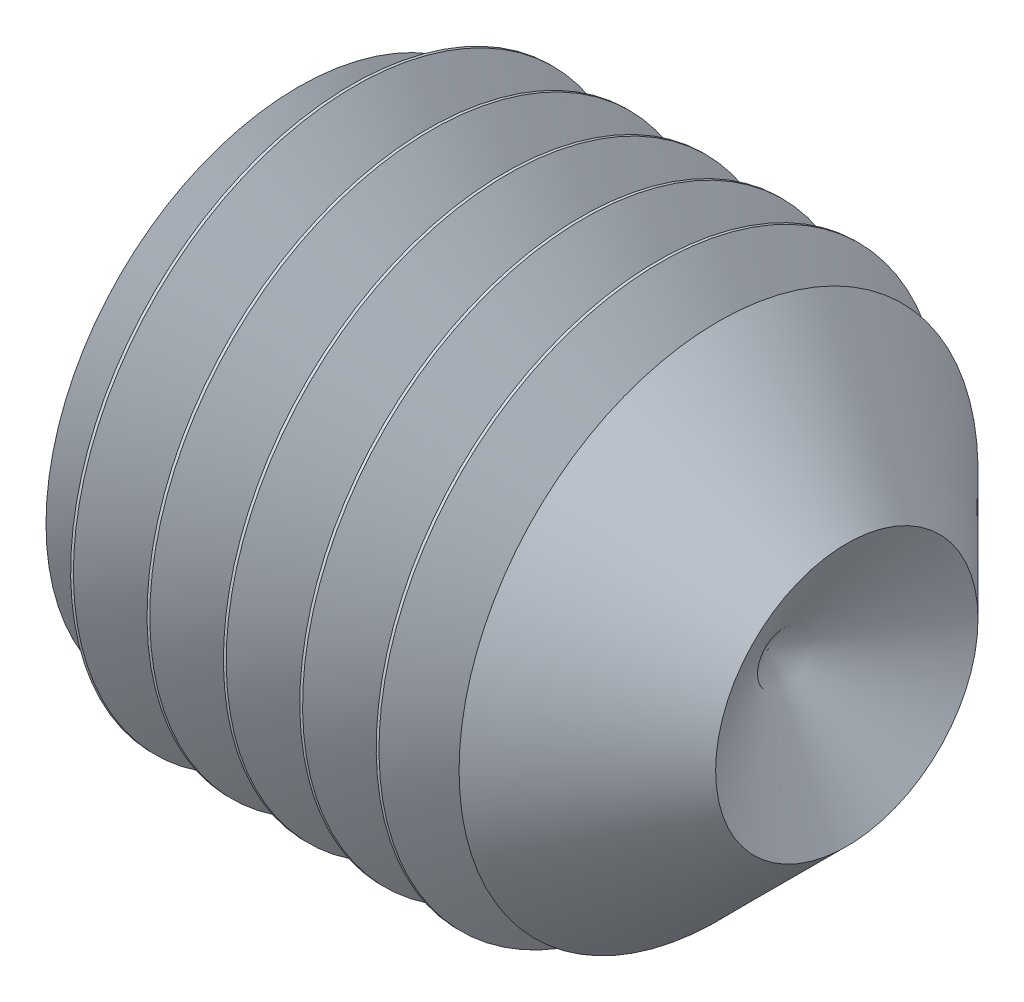
ISO-10303-21;
HEADER;
FILE_DESCRIPTION(('STEP AP214'),'2;1');
FILE_NAME('part.step','',(''),(''),'','','');
FILE_SCHEMA(('AUTOMOTIVE_DESIGN { 1 0 10303 214 1 1 1 1 }'));
ENDSEC;
DATA;
#1=APPLICATION_CONTEXT('core data for automotive mechanical design processes');
#2=APPLICATION_PROTOCOL_DEFINITION('international standard','automotive_design',2000,#1);
#3=PRODUCT_CONTEXT('',#1,'mechanical');
#4=PRODUCT('Part','Part','',(#3));
#5=PRODUCT_RELATED_PRODUCT_CATEGORY('part','',(#4));
#6=PRODUCT_DEFINITION_FORMATION('','',#4);
#7=PRODUCT_DEFINITION_CONTEXT('part definition',#1,'design');
#8=PRODUCT_DEFINITION('design','',#6,#7);
#9=PRODUCT_DEFINITION_SHAPE('','',#8);
#10=(LENGTH_UNIT() NAMED_UNIT(*) SI_UNIT(.MILLI.,.METRE.));
#11=(NAMED_UNIT(*) PLANE_ANGLE_UNIT() SI_UNIT($,.RADIAN.));
#12=(NAMED_UNIT(*) SI_UNIT($,.STERADIAN.) SOLID_ANGLE_UNIT());
#13=UNCERTAINTY_MEASURE_WITH_UNIT(LENGTH_MEASURE(1.E-05),#10,'distance_accuracy_value','');
#14=(GEOMETRIC_REPRESENTATION_CONTEXT(3) GLOBAL_UNCERTAINTY_ASSIGNED_CONTEXT((#13)) GLOBAL_UNIT_ASSIGNED_CONTEXT((#10,
#11,#12)) REPRESENTATION_CONTEXT('',''));
#15=CARTESIAN_POINT('',(0.,0.,0.));
#16=DIRECTION('',(0.,0.,1.));
#17=DIRECTION('',(1.,0.,0.));
#18=AXIS2_PLACEMENT_3D('',#15,#16,#17);
#19=CARTESIAN_POINT('',(0.,0.,0.));
#20=DIRECTION('',(-1.,0.,0.));
#21=DIRECTION('',(0.,0.,1.));
#22=AXIS2_PLACEMENT_3D('',#19,#20,#21);
#23=PLANE('',#22);
#24=CARTESIAN_POINT('',(0.,0.,0.));
#25=DIRECTION('',(-1.,0.,0.));
#26=DIRECTION('',(0.,0.,1.));
#27=AXIS2_PLACEMENT_3D('',#24,#25,#26);
#28=CIRCLE('',#27,1.2195);
#29=CARTESIAN_POINT('',(0.,0.,1.2195));
#30=VERTEX_POINT('',#29);
#31=EDGE_CURVE('E11',#30,#30,#28,.T.);
#32=ORIENTED_EDGE('',*,*,#31,.T.);
#33=EDGE_LOOP('',(#32));
#34=FACE_BOUND('',#33,.T.);
#35=DIRECTION('',(0.,0.,-1.));
#36=VECTOR('',#35,1.);
#37=CARTESIAN_POINT('',(0.,0.750000000000003,0.433012701892216));
#38=LINE('',#37,#36);
#39=CARTESIAN_POINT('',(0.,0.750000000000003,0.433012701892216));
#40=VERTEX_POINT('',#39);
#41=CARTESIAN_POINT('',(0.,0.750000000000003,-0.433012701892222));
#42=VERTEX_POINT('',#41);
#43=EDGE_CURVE('E98',#40,#42,#38,.T.);
#44=ORIENTED_EDGE('',*,*,#43,.F.);
#45=DIRECTION('',(0.,-0.866025403784439,0.5));
#46=VECTOR('',#45,1.);
#47=CARTESIAN_POINT('',(0.,0.750000000000003,0.433012701892216));
#48=LINE('',#47,#46);
#49=CARTESIAN_POINT('',(0.,0.,0.866025403784435));
#50=VERTEX_POINT('',#49);
#51=EDGE_CURVE('E51',#40,#50,#48,.T.);
#52=ORIENTED_EDGE('',*,*,#51,.T.);
#53=DIRECTION('',(0.,0.866025403784439,0.5));
#54=VECTOR('',#53,1.);
#55=CARTESIAN_POINT('',(0.,-0.749999999999996,0.433012701892216));
#56=LINE('',#55,#54);
#57=CARTESIAN_POINT('',(0.,-0.749999999999996,0.433012701892216));
#58=VERTEX_POINT('',#57);
#59=EDGE_CURVE('E104',#58,#50,#56,.T.);
#60=ORIENTED_EDGE('',*,*,#59,.F.);
#61=DIRECTION('',(0.,0.,-1.));
#62=VECTOR('',#61,1.);
#63=CARTESIAN_POINT('',(0.,-0.749999999999996,0.433012701892216));
#64=LINE('',#63,#62);
#65=CARTESIAN_POINT('',(0.,-0.749999999999996,-0.433012701892222));
#66=VERTEX_POINT('',#65);
#67=EDGE_CURVE('E125',#58,#66,#64,.T.);
#68=ORIENTED_EDGE('',*,*,#67,.T.);
#69=DIRECTION('',(0.,0.866025403784438,-0.500000000000001));
#70=VECTOR('',#69,1.);
#71=CARTESIAN_POINT('',(0.,-0.749999999999996,-0.433012701892222));
#72=LINE('',#71,#70);
#73=CARTESIAN_POINT('',(0.,0.,-0.866025403784441));
#74=VERTEX_POINT('',#73);
#75=EDGE_CURVE('E128',#66,#74,#72,.T.);
#76=ORIENTED_EDGE('',*,*,#75,.T.);
#77=DIRECTION('',(0.,-0.866025403784439,-0.5));
#78=VECTOR('',#77,1.);
#79=CARTESIAN_POINT('',(0.,0.750000000000003,-0.433012701892222));
#80=LINE('',#79,#78);
#81=EDGE_CURVE('E131',#42,#74,#80,.T.);
#82=ORIENTED_EDGE('',*,*,#81,.F.);
#83=EDGE_LOOP('',(#44,#52,#60,#68,#76,#82));
#84=FACE_BOUND('',#83,.T.);
#85=ADVANCED_FACE('F35',(#34,#84),#23,.T.);
#86=CARTESIAN_POINT('',(0.,0.,0.));
#87=DIRECTION('',(1.,0.,0.));
#88=DIRECTION('',(0.,0.,-1.));
#89=AXIS2_PLACEMENT_3D('',#86,#87,#88);
#90=CONICAL_SURFACE('',#89,1.2195,1.0471975511966);
#91=CARTESIAN_POINT('',(0.0731865121550403,0.,0.));
#92=DIRECTION('',(-1.,0.,0.));
#93=DIRECTION('',(0.,-1.,0.));
#94=AXIS2_PLACEMENT_3D('',#91,#92,#93);
#95=CIRCLE('',#94,1.34626275748129);
#96=CARTESIAN_POINT('',(0.0731865121550405,-1.34626275748129,0.));
#97=VERTEX_POINT('',#96);
#98=EDGE_CURVE('E123',#97,#97,#95,.F.);
#99=ORIENTED_EDGE('',*,*,#98,.F.);
#100=EDGE_LOOP('',(#99));
#101=FACE_BOUND('',#100,.T.);
#102=ORIENTED_EDGE('',*,*,#31,.F.);
#103=EDGE_LOOP('',(#102));
#104=FACE_BOUND('',#103,.T.);
#105=ADVANCED_FACE('F221',(#101,#104),#90,.T.);
#106=CARTESIAN_POINT('',(1.5,0.750000000000003,0.433012701892216));
#107=DIRECTION('',(0.,-0.5,-0.866025403784438));
#108=DIRECTION('',(0.,0.866025403784439,-0.5));
#109=AXIS2_PLACEMENT_3D('',#106,#107,#108);
#110=PLANE('',#109);
#111=ORIENTED_EDGE('',*,*,#51,.F.);
#112=DIRECTION('',(-1.,0.,0.));
#113=VECTOR('',#112,1.);
#114=CARTESIAN_POINT('',(1.5,0.750000000000003,0.433012701892216));
#115=LINE('',#114,#113);
#116=CARTESIAN_POINT('',(1.5,0.750000000000003,0.433012701892216));
#117=VERTEX_POINT('',#116);
#118=EDGE_CURVE('E92',#117,#40,#115,.T.);
#119=ORIENTED_EDGE('',*,*,#118,.F.);
#120=DIRECTION('',(0.,-0.866025403784439,0.5));
#121=VECTOR('',#120,1.);
#122=CARTESIAN_POINT('',(1.5,0.750000000000003,0.433012701892216));
#123=LINE('',#122,#121);
#124=CARTESIAN_POINT('',(1.5,0.,0.866025403784435));
#125=VERTEX_POINT('',#124);
#126=EDGE_CURVE('E87',#117,#125,#123,.T.);
#127=ORIENTED_EDGE('',*,*,#126,.T.);
#128=DIRECTION('',(-1.,0.,0.));
#129=VECTOR('',#128,1.);
#130=CARTESIAN_POINT('',(1.5,0.,0.866025403784435));
#131=LINE('',#130,#129);
#132=EDGE_CURVE('E90',#125,#50,#131,.T.);
#133=ORIENTED_EDGE('',*,*,#132,.T.);
#134=EDGE_LOOP('',(#111,#119,#127,#133));
#135=FACE_BOUND('',#134,.T.);
#136=ADVANCED_FACE('F89',(#135),#110,.T.);
#137=CARTESIAN_POINT('',(1.5,-0.749999999999996,0.433012701892216));
#138=DIRECTION('',(0.,-0.5,0.866025403784439));
#139=DIRECTION('',(0.,-0.866025403784439,-0.5));
#140=AXIS2_PLACEMENT_3D('',#137,#138,#139);
#141=PLANE('',#140);
#142=ORIENTED_EDGE('',*,*,#59,.T.);
#143=ORIENTED_EDGE('',*,*,#132,.F.);
#144=DIRECTION('',(0.,0.866025403784439,0.5));
#145=VECTOR('',#144,1.);
#146=CARTESIAN_POINT('',(1.5,-0.749999999999996,0.433012701892216));
#147=LINE('',#146,#145);
#148=CARTESIAN_POINT('',(1.5,-0.749999999999996,0.433012701892216));
#149=VERTEX_POINT('',#148);
#150=EDGE_CURVE('E97',#149,#125,#147,.T.);
#151=ORIENTED_EDGE('',*,*,#150,.F.);
#152=DIRECTION('',(-1.,0.,0.));
#153=VECTOR('',#152,1.);
#154=CARTESIAN_POINT('',(1.5,-0.749999999999996,0.433012701892216));
#155=LINE('',#154,#153);
#156=EDGE_CURVE('E105',#149,#58,#155,.T.);
#157=ORIENTED_EDGE('',*,*,#156,.T.);
#158=EDGE_LOOP('',(#142,#143,#151,#157));
#159=FACE_BOUND('',#158,.T.);
#160=ADVANCED_FACE('F102',(#159),#141,.F.);
#161=CARTESIAN_POINT('',(1.5,-0.749999999999996,0.433012701892216));
#162=DIRECTION('',(0.,1.,0.));
#163=DIRECTION('',(0.,0.,1.));
#164=AXIS2_PLACEMENT_3D('',#161,#162,#163);
#165=PLANE('',#164);
#166=ORIENTED_EDGE('',*,*,#67,.F.);
#167=ORIENTED_EDGE('',*,*,#156,.F.);
#168=DIRECTION('',(0.,0.,-1.));
#169=VECTOR('',#168,1.);
#170=CARTESIAN_POINT('',(1.5,-0.749999999999996,0.433012701892216));
#171=LINE('',#170,#169);
#172=CARTESIAN_POINT('',(1.5,-0.749999999999996,-0.433012701892222));
#173=VERTEX_POINT('',#172);
#174=EDGE_CURVE('E110',#149,#173,#171,.T.);
#175=ORIENTED_EDGE('',*,*,#174,.T.);
#176=DIRECTION('',(-1.,0.,0.));
#177=VECTOR('',#176,1.);
#178=CARTESIAN_POINT('',(1.5,-0.749999999999996,-0.433012701892222));
#179=LINE('',#178,#177);
#180=EDGE_CURVE('E141',#173,#66,#179,.T.);
#181=ORIENTED_EDGE('',*,*,#180,.T.);
#182=EDGE_LOOP('',(#166,#167,#175,#181));
#183=FACE_BOUND('',#182,.T.);
#184=ADVANCED_FACE('F243',(#183),#165,.T.);
#185=CARTESIAN_POINT('',(1.5,-0.749999999999996,-0.433012701892222));
#186=DIRECTION('',(0.,0.500000000000001,0.866025403784438));
#187=DIRECTION('',(0.,-0.866025403784438,0.500000000000001));
#188=AXIS2_PLACEMENT_3D('',#185,#186,#187);
#189=PLANE('',#188);
#190=ORIENTED_EDGE('',*,*,#75,.F.);
#191=ORIENTED_EDGE('',*,*,#180,.F.);
#192=DIRECTION('',(0.,0.866025403784438,-0.500000000000001));
#193=VECTOR('',#192,1.);
#194=CARTESIAN_POINT('',(1.5,-0.749999999999996,-0.433012701892222));
#195=LINE('',#194,#193);
#196=CARTESIAN_POINT('',(1.5,0.,-0.866025403784441));
#197=VERTEX_POINT('',#196);
#198=EDGE_CURVE('E112',#173,#197,#195,.T.);
#199=ORIENTED_EDGE('',*,*,#198,.T.);
#200=DIRECTION('',(-1.,0.,0.));
#201=VECTOR('',#200,1.);
#202=CARTESIAN_POINT('',(1.5,0.,-0.866025403784441));
#203=LINE('',#202,#201);
#204=EDGE_CURVE('E139',#197,#74,#203,.T.);
#205=ORIENTED_EDGE('',*,*,#204,.T.);
#206=EDGE_LOOP('',(#190,#191,#199,#205));
#207=FACE_BOUND('',#206,.T.);
#208=ADVANCED_FACE('F239',(#207),#189,.T.);
#209=CARTESIAN_POINT('',(1.5,0.750000000000003,-0.433012701892222));
#210=DIRECTION('',(0.,0.5,-0.866025403784439));
#211=DIRECTION('',(0.,0.866025403784439,0.5));
#212=AXIS2_PLACEMENT_3D('',#209,#210,#211);
#213=PLANE('',#212);
#214=ORIENTED_EDGE('',*,*,#81,.T.);
#215=ORIENTED_EDGE('',*,*,#204,.F.);
#216=DIRECTION('',(0.,-0.866025403784439,-0.5));
#217=VECTOR('',#216,1.);
#218=CARTESIAN_POINT('',(1.5,0.750000000000003,-0.433012701892222));
#219=LINE('',#218,#217);
#220=CARTESIAN_POINT('',(1.5,0.750000000000003,-0.433012701892222));
#221=VERTEX_POINT('',#220);
#222=EDGE_CURVE('E117',#221,#197,#219,.T.);
#223=ORIENTED_EDGE('',*,*,#222,.F.);
#224=DIRECTION('',(-1.,0.,0.));
#225=VECTOR('',#224,1.);
#226=CARTESIAN_POINT('',(1.5,0.750000000000003,-0.433012701892222));
#227=LINE('',#226,#225);
#228=EDGE_CURVE('E137',#221,#42,#227,.T.);
#229=ORIENTED_EDGE('',*,*,#228,.T.);
#230=EDGE_LOOP('',(#214,#215,#223,#229));
#231=FACE_BOUND('',#230,.T.);
#232=ADVANCED_FACE('F236',(#231),#213,.F.);
#233=CARTESIAN_POINT('',(1.5,0.750000000000003,0.433012701892216));
#234=DIRECTION('',(0.,1.,0.));
#235=DIRECTION('',(0.,0.,1.));
#236=AXIS2_PLACEMENT_3D('',#233,#234,#235);
#237=PLANE('',#236);
#238=ORIENTED_EDGE('',*,*,#43,.T.);
#239=ORIENTED_EDGE('',*,*,#228,.F.);
#240=DIRECTION('',(0.,0.,-1.));
#241=VECTOR('',#240,1.);
#242=CARTESIAN_POINT('',(1.5,0.750000000000003,0.433012701892216));
#243=LINE('',#242,#241);
#244=EDGE_CURVE('E120',#117,#221,#243,.T.);
#245=ORIENTED_EDGE('',*,*,#244,.F.);
#246=ORIENTED_EDGE('',*,*,#118,.T.);
#247=EDGE_LOOP('',(#238,#239,#245,#246));
#248=FACE_BOUND('',#247,.T.);
#249=ADVANCED_FACE('F232',(#248),#237,.F.);
#250=CARTESIAN_POINT('',(1.5,1.5,0.));
#251=DIRECTION('',(1.,0.,0.));
#252=DIRECTION('',(0.,0.,-1.));
#253=AXIS2_PLACEMENT_3D('',#250,#251,#252);
#254=PLANE('',#253);
#255=ORIENTED_EDGE('',*,*,#126,.F.);
#256=ORIENTED_EDGE('',*,*,#244,.T.);
#257=ORIENTED_EDGE('',*,*,#222,.T.);
#258=ORIENTED_EDGE('',*,*,#198,.F.);
#259=ORIENTED_EDGE('',*,*,#174,.F.);
#260=ORIENTED_EDGE('',*,*,#150,.T.);
#261=EDGE_LOOP('',(#255,#256,#257,#258,#259,#260));
#262=FACE_BOUND('',#261,.T.);
#263=ADVANCED_FACE('F108',(#262),#254,.F.);
#264=CARTESIAN_POINT('',(0.358354964975511,0.,0.));
#265=DIRECTION('',(1.,0.,0.));
#266=DIRECTION('',(0.,1.,0.));
#267=AXIS2_PLACEMENT_3D('',#264,#265,#266);
#268=CONICAL_SURFACE('',#267,1.5,0.959931088596883);
#269=CARTESIAN_POINT('',(0.161946750507689,0.,0.));
#270=DIRECTION('',(-1.,0.,0.));
#271=DIRECTION('',(0.,-1.,0.));
#272=AXIS2_PLACEMENT_3D('',#269,#270,#271);
#273=CIRCLE('',#272,1.2195);
#274=CARTESIAN_POINT('',(0.161946750507689,-1.2195,0.));
#275=VERTEX_POINT('',#274);
#276=EDGE_CURVE('E150',#275,#275,#273,.T.);
#277=ORIENTED_EDGE('',*,*,#276,.F.);
#278=EDGE_LOOP('',(#277));
#279=FACE_BOUND('',#278,.T.);
#280=CARTESIAN_POINT('',(0.358354964975511,0.,0.));
#281=DIRECTION('',(-1.,0.,0.));
#282=DIRECTION('',(0.,-1.,0.));
#283=AXIS2_PLACEMENT_3D('',#280,#281,#282);
#284=CIRCLE('',#283,1.5);
#285=CARTESIAN_POINT('',(0.358354964975512,-1.5,0.));
#286=VERTEX_POINT('',#285);
#287=EDGE_CURVE('E146',#286,#286,#284,.T.);
#288=ORIENTED_EDGE('',*,*,#287,.T.);
#289=EDGE_LOOP('',(#288));
#290=FACE_BOUND('',#289,.T.);
#291=ADVANCED_FACE('F274',(#279,#290),#268,.T.);
#292=CARTESIAN_POINT('',(0.161946750507689,0.,0.));
#293=DIRECTION('',(-1.,0.,0.));
#294=DIRECTION('',(0.,-1.,0.));
#295=AXIS2_PLACEMENT_3D('',#292,#293,#294);
#296=CONICAL_SURFACE('',#295,1.2195,0.959931088596876);
#297=ORIENTED_EDGE('',*,*,#98,.T.);
#298=EDGE_LOOP('',(#297));
#299=FACE_BOUND('',#298,.T.);
#300=ORIENTED_EDGE('',*,*,#276,.T.);
#301=EDGE_LOOP('',(#300));
#302=FACE_BOUND('',#301,.T.);
#303=ADVANCED_FACE('F264',(#299,#302),#296,.T.);
#304=CARTESIAN_POINT('',(-12.7,0.,0.));
#305=DIRECTION('',(-1.,0.,0.));
#306=DIRECTION('',(0.,0.,1.));
#307=AXIS2_PLACEMENT_3D('',#304,#305,#306);
#308=CYLINDRICAL_SURFACE('',#307,1.5);
#309=CARTESIAN_POINT('',(0.373149210915998,0.,0.));
#310=DIRECTION('',(-1.,0.,0.));
#311=DIRECTION('',(0.,-1.,0.));
#312=AXIS2_PLACEMENT_3D('',#309,#310,#311);
#313=CIRCLE('',#312,1.5);
#314=CARTESIAN_POINT('',(0.373149210915998,-1.5,0.));
#315=VERTEX_POINT('',#314);
#316=EDGE_CURVE('E159',#315,#315,#313,.T.);
#317=ORIENTED_EDGE('',*,*,#316,.T.);
#318=EDGE_LOOP('',(#317));
#319=FACE_BOUND('',#318,.T.);
#320=ORIENTED_EDGE('',*,*,#287,.F.);
#321=EDGE_LOOP('',(#320));
#322=FACE_BOUND('',#321,.T.);
#323=ADVANCED_FACE('F217',(#319,#322),#308,.T.);
#324=CARTESIAN_POINT('',(0.765965639851646,0.,0.));
#325=DIRECTION('',(1.,0.,0.));
#326=DIRECTION('',(0.,1.,0.));
#327=AXIS2_PLACEMENT_3D('',#324,#325,#326);
#328=CONICAL_SURFACE('',#327,1.5,0.959931088596883);
#329=CARTESIAN_POINT('',(0.569557425383823,0.,0.));
#330=DIRECTION('',(-1.,0.,0.));
#331=DIRECTION('',(0.,-1.,0.));
#332=AXIS2_PLACEMENT_3D('',#329,#330,#331);
#333=CIRCLE('',#332,1.2195);
#334=CARTESIAN_POINT('',(0.569557425383824,-1.2195,0.));
#335=VERTEX_POINT('',#334);
#336=EDGE_CURVE('E162',#335,#335,#333,.T.);
#337=ORIENTED_EDGE('',*,*,#336,.F.);
#338=EDGE_LOOP('',(#337));
#339=FACE_BOUND('',#338,.T.);
#340=CARTESIAN_POINT('',(0.765965639851646,0.,0.));
#341=DIRECTION('',(-1.,0.,0.));
#342=DIRECTION('',(0.,-1.,0.));
#343=AXIS2_PLACEMENT_3D('',#340,#341,#342);
#344=CIRCLE('',#343,1.5);
#345=CARTESIAN_POINT('',(0.765965639851646,-1.5,0.));
#346=VERTEX_POINT('',#345);
#347=EDGE_CURVE('E154',#346,#346,#344,.T.);
#348=ORIENTED_EDGE('',*,*,#347,.T.);
#349=EDGE_LOOP('',(#348));
#350=FACE_BOUND('',#349,.T.);
#351=ADVANCED_FACE('F263',(#339,#350),#328,.T.);
#352=CARTESIAN_POINT('',(0.569557425383823,0.,0.));
#353=DIRECTION('',(-1.,0.,0.));
#354=DIRECTION('',(0.,-1.,0.));
#355=AXIS2_PLACEMENT_3D('',#352,#353,#354);
#356=CONICAL_SURFACE('',#355,1.2195,0.959931088596876);
#357=ORIENTED_EDGE('',*,*,#316,.F.);
#358=EDGE_LOOP('',(#357));
#359=FACE_BOUND('',#358,.T.);
#360=ORIENTED_EDGE('',*,*,#336,.T.);
#361=EDGE_LOOP('',(#360));
#362=FACE_BOUND('',#361,.T.);
#363=ADVANCED_FACE('F271',(#359,#362),#356,.T.);
#364=CARTESIAN_POINT('',(0.780759885792133,0.,0.));
#365=DIRECTION('',(-1.,0.,0.));
#366=DIRECTION('',(0.,-1.,0.));
#367=AXIS2_PLACEMENT_3D('',#364,#365,#366);
#368=CIRCLE('',#367,1.5);
#369=CARTESIAN_POINT('',(0.780759885792133,-1.5,0.));
#370=VERTEX_POINT('',#369);
#371=EDGE_CURVE('E168',#370,#370,#368,.T.);
#372=ORIENTED_EDGE('',*,*,#371,.T.);
#373=EDGE_LOOP('',(#372));
#374=FACE_BOUND('',#373,.T.);
#375=ORIENTED_EDGE('',*,*,#347,.F.);
#376=EDGE_LOOP('',(#375));
#377=FACE_BOUND('',#376,.T.);
#378=ADVANCED_FACE('F266',(#374,#377),#308,.T.);
#379=CARTESIAN_POINT('',(1.17357631472778,0.,0.));
#380=DIRECTION('',(1.,0.,0.));
#381=DIRECTION('',(0.,1.,0.));
#382=AXIS2_PLACEMENT_3D('',#379,#380,#381);
#383=CONICAL_SURFACE('',#382,1.5,0.959931088596883);
#384=CARTESIAN_POINT('',(0.977168100259958,0.,0.));
#385=DIRECTION('',(-1.,0.,0.));
#386=DIRECTION('',(0.,-1.,0.));
#387=AXIS2_PLACEMENT_3D('',#384,#385,#386);
#388=CIRCLE('',#387,1.2195);
#389=CARTESIAN_POINT('',(0.977168100259959,-1.2195,0.));
#390=VERTEX_POINT('',#389);
#391=EDGE_CURVE('E171',#390,#390,#388,.T.);
#392=ORIENTED_EDGE('',*,*,#391,.F.);
#393=EDGE_LOOP('',(#392));
#394=FACE_BOUND('',#393,.T.);
#395=CARTESIAN_POINT('',(1.17357631472778,0.,0.));
#396=DIRECTION('',(-1.,0.,0.));
#397=DIRECTION('',(0.,-1.,0.));
#398=AXIS2_PLACEMENT_3D('',#395,#396,#397);
#399=CIRCLE('',#398,1.5);
#400=CARTESIAN_POINT('',(1.17357631472778,-1.5,0.));
#401=VERTEX_POINT('',#400);
#402=EDGE_CURVE('E165',#401,#401,#399,.T.);
#403=ORIENTED_EDGE('',*,*,#402,.T.);
#404=EDGE_LOOP('',(#403));
#405=FACE_BOUND('',#404,.T.);
#406=ADVANCED_FACE('F278',(#394,#405),#383,.T.);
#407=CARTESIAN_POINT('',(0.977168100259958,0.,0.));
#408=DIRECTION('',(-1.,0.,0.));
#409=DIRECTION('',(0.,-1.,0.));
#410=AXIS2_PLACEMENT_3D('',#407,#408,#409);
#411=CONICAL_SURFACE('',#410,1.2195,0.959931088596876);
#412=ORIENTED_EDGE('',*,*,#371,.F.);
#413=EDGE_LOOP('',(#412));
#414=FACE_BOUND('',#413,.T.);
#415=ORIENTED_EDGE('',*,*,#391,.T.);
#416=EDGE_LOOP('',(#415));
#417=FACE_BOUND('',#416,.T.);
#418=ADVANCED_FACE('F285',(#414,#417),#411,.T.);
#419=CARTESIAN_POINT('',(1.18837056066827,0.,0.));
#420=DIRECTION('',(-1.,0.,0.));
#421=DIRECTION('',(0.,-1.,0.));
#422=AXIS2_PLACEMENT_3D('',#419,#420,#421);
#423=CIRCLE('',#422,1.5);
#424=CARTESIAN_POINT('',(1.18837056066827,-1.5,0.));
#425=VERTEX_POINT('',#424);
#426=EDGE_CURVE('E177',#425,#425,#423,.T.);
#427=ORIENTED_EDGE('',*,*,#426,.T.);
#428=EDGE_LOOP('',(#427));
#429=FACE_BOUND('',#428,.T.);
#430=ORIENTED_EDGE('',*,*,#402,.F.);
#431=EDGE_LOOP('',(#430));
#432=FACE_BOUND('',#431,.T.);
#433=ADVANCED_FACE('F280',(#429,#432),#308,.T.);
#434=CARTESIAN_POINT('',(1.58118698960392,0.,0.));
#435=DIRECTION('',(1.,0.,0.));
#436=DIRECTION('',(0.,1.,0.));
#437=AXIS2_PLACEMENT_3D('',#434,#435,#436);
#438=CONICAL_SURFACE('',#437,1.5,0.959931088596883);
#439=CARTESIAN_POINT('',(1.38477877513609,0.,0.));
#440=DIRECTION('',(-1.,0.,0.));
#441=DIRECTION('',(0.,-1.,0.));
#442=AXIS2_PLACEMENT_3D('',#439,#440,#441);
#443=CIRCLE('',#442,1.2195);
#444=CARTESIAN_POINT('',(1.38477877513609,-1.2195,0.));
#445=VERTEX_POINT('',#444);
#446=EDGE_CURVE('E180',#445,#445,#443,.T.);
#447=ORIENTED_EDGE('',*,*,#446,.F.);
#448=EDGE_LOOP('',(#447));
#449=FACE_BOUND('',#448,.T.);
#450=CARTESIAN_POINT('',(1.58118698960392,0.,0.));
#451=DIRECTION('',(-1.,0.,0.));
#452=DIRECTION('',(0.,-1.,0.));
#453=AXIS2_PLACEMENT_3D('',#450,#451,#452);
#454=CIRCLE('',#453,1.5);
#455=CARTESIAN_POINT('',(1.58118698960392,-1.5,0.));
#456=VERTEX_POINT('',#455);
#457=EDGE_CURVE('E174',#456,#456,#454,.T.);
#458=ORIENTED_EDGE('',*,*,#457,.T.);
#459=EDGE_LOOP('',(#458));
#460=FACE_BOUND('',#459,.T.);
#461=ADVANCED_FACE('F292',(#449,#460),#438,.T.);
#462=CARTESIAN_POINT('',(1.38477877513609,0.,0.));
#463=DIRECTION('',(-1.,0.,0.));
#464=DIRECTION('',(0.,-1.,0.));
#465=AXIS2_PLACEMENT_3D('',#462,#463,#464);
#466=CONICAL_SURFACE('',#465,1.2195,0.959931088596876);
#467=ORIENTED_EDGE('',*,*,#426,.F.);
#468=EDGE_LOOP('',(#467));
#469=FACE_BOUND('',#468,.T.);
#470=ORIENTED_EDGE('',*,*,#446,.T.);
#471=EDGE_LOOP('',(#470));
#472=FACE_BOUND('',#471,.T.);
#473=ADVANCED_FACE('F298',(#469,#472),#466,.T.);
#474=CARTESIAN_POINT('',(1.5959812355444,0.,0.));
#475=DIRECTION('',(-1.,0.,0.));
#476=DIRECTION('',(0.,-1.,0.));
#477=AXIS2_PLACEMENT_3D('',#474,#475,#476);
#478=CIRCLE('',#477,1.5);
#479=CARTESIAN_POINT('',(1.5959812355444,-1.5,0.));
#480=VERTEX_POINT('',#479);
#481=EDGE_CURVE('E186',#480,#480,#478,.T.);
#482=ORIENTED_EDGE('',*,*,#481,.T.);
#483=EDGE_LOOP('',(#482));
#484=FACE_BOUND('',#483,.T.);
#485=ORIENTED_EDGE('',*,*,#457,.F.);
#486=EDGE_LOOP('',(#485));
#487=FACE_BOUND('',#486,.T.);
#488=ADVANCED_FACE('F216',(#484,#487),#308,.T.);
#489=CARTESIAN_POINT('',(1.98879766448005,0.,0.));
#490=DIRECTION('',(1.,0.,0.));
#491=DIRECTION('',(0.,1.,0.));
#492=AXIS2_PLACEMENT_3D('',#489,#490,#491);
#493=CONICAL_SURFACE('',#492,1.5,0.959931088596883);
#494=CARTESIAN_POINT('',(1.79238945001223,0.,0.));
#495=DIRECTION('',(-1.,0.,0.));
#496=DIRECTION('',(0.,-1.,0.));
#497=AXIS2_PLACEMENT_3D('',#494,#495,#496);
#498=CIRCLE('',#497,1.2195);
#499=CARTESIAN_POINT('',(1.79238945001223,-1.2195,0.));
#500=VERTEX_POINT('',#499);
#501=EDGE_CURVE('E189',#500,#500,#498,.T.);
#502=ORIENTED_EDGE('',*,*,#501,.F.);
#503=EDGE_LOOP('',(#502));
#504=FACE_BOUND('',#503,.T.);
#505=CARTESIAN_POINT('',(1.98879766448005,0.,0.));
#506=DIRECTION('',(-1.,0.,0.));
#507=DIRECTION('',(0.,-1.,0.));
#508=AXIS2_PLACEMENT_3D('',#505,#506,#507);
#509=CIRCLE('',#508,1.5);
#510=CARTESIAN_POINT('',(1.98879766448005,-1.5,0.));
#511=VERTEX_POINT('',#510);
#512=EDGE_CURVE('E183',#511,#511,#509,.T.);
#513=ORIENTED_EDGE('',*,*,#512,.T.);
#514=EDGE_LOOP('',(#513));
#515=FACE_BOUND('',#514,.T.);
#516=ADVANCED_FACE('F305',(#504,#515),#493,.T.);
#517=CARTESIAN_POINT('',(1.79238945001223,0.,0.));
#518=DIRECTION('',(-1.,0.,0.));
#519=DIRECTION('',(0.,-1.,0.));
#520=AXIS2_PLACEMENT_3D('',#517,#518,#519);
#521=CONICAL_SURFACE('',#520,1.2195,0.959931088596876);
#522=ORIENTED_EDGE('',*,*,#481,.F.);
#523=EDGE_LOOP('',(#522));
#524=FACE_BOUND('',#523,.T.);
#525=ORIENTED_EDGE('',*,*,#501,.T.);
#526=EDGE_LOOP('',(#525));
#527=FACE_BOUND('',#526,.T.);
#528=ADVANCED_FACE('F213',(#524,#527),#521,.T.);
#529=CARTESIAN_POINT('',(2.00359191042054,0.,0.));
#530=DIRECTION('',(-1.,0.,0.));
#531=DIRECTION('',(0.,-1.,0.));
#532=AXIS2_PLACEMENT_3D('',#529,#530,#531);
#533=CIRCLE('',#532,1.5);
#534=CARTESIAN_POINT('',(2.00359191042054,-1.5,0.));
#535=VERTEX_POINT('',#534);
#536=EDGE_CURVE('E192',#535,#535,#533,.T.);
#537=ORIENTED_EDGE('',*,*,#536,.T.);
#538=EDGE_LOOP('',(#537));
#539=FACE_BOUND('',#538,.T.);
#540=ORIENTED_EDGE('',*,*,#512,.F.);
#541=EDGE_LOOP('',(#540));
#542=FACE_BOUND('',#541,.T.);
#543=ADVANCED_FACE('F203',(#539,#542),#308,.T.);
#544=CARTESIAN_POINT('',(2.39640833935619,0.,0.));
#545=DIRECTION('',(1.,0.,0.));
#546=DIRECTION('',(0.,1.,0.));
#547=AXIS2_PLACEMENT_3D('',#544,#545,#546);
#548=CONICAL_SURFACE('',#547,1.5,0.959931088596883);
#549=CARTESIAN_POINT('',(2.31552021441042,0.,0.));
#550=DIRECTION('',(1.,0.,0.));
#551=DIRECTION('',(0.,1.,0.));
#552=AXIS2_PLACEMENT_3D('',#549,#550,#551);
#553=CIRCLE('',#552,1.38447978558959);
#554=CARTESIAN_POINT('',(2.31552021441042,1.38447978558959,0.));
#555=VERTEX_POINT('',#554);
#556=EDGE_CURVE('E38',#555,#555,#553,.F.);
#557=ORIENTED_EDGE('',*,*,#556,.T.);
#558=EDGE_LOOP('',(#557));
#559=FACE_BOUND('',#558,.T.);
#560=CARTESIAN_POINT('',(2.20000012488836,0.,0.));
#561=DIRECTION('',(-1.,0.,0.));
#562=DIRECTION('',(0.,-1.,0.));
#563=AXIS2_PLACEMENT_3D('',#560,#561,#562);
#564=CIRCLE('',#563,1.2195);
#565=CARTESIAN_POINT('',(2.20000012488836,-1.2195,0.));
#566=VERTEX_POINT('',#565);
#567=EDGE_CURVE('E195',#566,#566,#564,.T.);
#568=ORIENTED_EDGE('',*,*,#567,.F.);
#569=EDGE_LOOP('',(#568));
#570=FACE_BOUND('',#569,.T.);
#571=ADVANCED_FACE('F201',(#559,#570),#548,.T.);
#572=CARTESIAN_POINT('',(2.20000012488836,0.,0.));
#573=DIRECTION('',(-1.,0.,0.));
#574=DIRECTION('',(0.,-1.,0.));
#575=AXIS2_PLACEMENT_3D('',#572,#573,#574);
#576=CONICAL_SURFACE('',#575,1.2195,0.959931088596876);
#577=ORIENTED_EDGE('',*,*,#536,.F.);
#578=EDGE_LOOP('',(#577));
#579=FACE_BOUND('',#578,.T.);
#580=ORIENTED_EDGE('',*,*,#567,.T.);
#581=EDGE_LOOP('',(#580));
#582=FACE_BOUND('',#581,.T.);
#583=ADVANCED_FACE('F199',(#579,#582),#576,.T.);
#584=CARTESIAN_POINT('',(2.57939756668071,0.,0.));
#585=DIRECTION('',(1.,0.,0.));
#586=DIRECTION('',(0.,0.,-1.));
#587=AXIS2_PLACEMENT_3D('',#584,#585,#586);
#588=CONICAL_SURFACE('',#587,0.,1.02974425867666);
#589=CARTESIAN_POINT('',(3.,0.,0.));
#590=DIRECTION('',(-1.,0.,0.));
#591=DIRECTION('',(0.,0.,1.));
#592=AXIS2_PLACEMENT_3D('',#589,#590,#591);
#593=CIRCLE('',#592,0.7);
#594=CARTESIAN_POINT('',(3.,0.,0.7));
#595=VERTEX_POINT('',#594);
#596=EDGE_CURVE('E43',#595,#595,#593,.T.);
#597=ORIENTED_EDGE('',*,*,#596,.F.);
#598=EDGE_LOOP('',(#597));
#599=FACE_BOUND('',#598,.T.);
#600=CARTESIAN_POINT('',(2.57939756668071,0.,0.));
#601=VERTEX_POINT('',#600);
#602=VERTEX_LOOP('',#601);
#603=FACE_BOUND('',#602,.T.);
#604=ADVANCED_FACE('F210',(#599,#603),#588,.F.);
#605=CARTESIAN_POINT('',(2.20000000000001,0.,0.));
#606=DIRECTION('',(-1.,0.,0.));
#607=DIRECTION('',(0.,0.,1.));
#608=AXIS2_PLACEMENT_3D('',#605,#606,#607);
#609=CONICAL_SURFACE('',#608,1.5,0.785398163397453);
#610=ORIENTED_EDGE('',*,*,#556,.F.);
#611=EDGE_LOOP('',(#610));
#612=FACE_BOUND('',#611,.T.);
#613=ORIENTED_EDGE('',*,*,#596,.T.);
#614=EDGE_LOOP('',(#613));
#615=FACE_BOUND('',#614,.T.);
#616=ADVANCED_FACE('F258',(#612,#615),#609,.T.);
#617=CLOSED_SHELL('',(#85,#105,#136,#160,#184,#208,#232,#249,#263,#291,#303,#323,#351,#363,#378,
#406,#418,#433,#461,#473,#488,#516,#528,#543,#571,#583,#604,#616));
#618=MANIFOLD_SOLID_BREP('B2',#617);
#619=ADVANCED_BREP_SHAPE_REPRESENTATION('',(#18,#618),#14);
#620=SHAPE_DEFINITION_REPRESENTATION(#9,#619);
ENDSEC;
END-ISO-10303-21;
